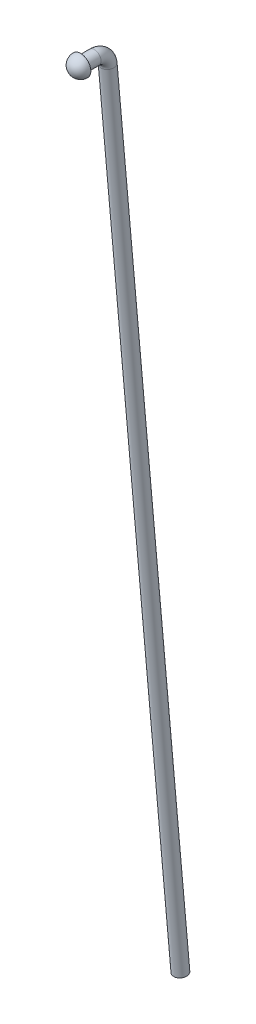
ISO-10303-21;
HEADER;
FILE_DESCRIPTION(('STEP AP214'),'2;1');
FILE_NAME('part.step','',(''),(''),'','','');
FILE_SCHEMA(('AUTOMOTIVE_DESIGN { 1 0 10303 214 1 1 1 1 }'));
ENDSEC;
DATA;
#1=APPLICATION_CONTEXT('core data for automotive mechanical design processes');
#2=APPLICATION_PROTOCOL_DEFINITION('international standard','automotive_design',2000,#1);
#3=PRODUCT_CONTEXT('',#1,'mechanical');
#4=PRODUCT('Part','Part','',(#3));
#5=PRODUCT_RELATED_PRODUCT_CATEGORY('part','',(#4));
#6=PRODUCT_DEFINITION_FORMATION('','',#4);
#7=PRODUCT_DEFINITION_CONTEXT('part definition',#1,'design');
#8=PRODUCT_DEFINITION('design','',#6,#7);
#9=PRODUCT_DEFINITION_SHAPE('','',#8);
#10=(LENGTH_UNIT() NAMED_UNIT(*) SI_UNIT(.MILLI.,.METRE.));
#11=(NAMED_UNIT(*) PLANE_ANGLE_UNIT() SI_UNIT($,.RADIAN.));
#12=(NAMED_UNIT(*) SI_UNIT($,.STERADIAN.) SOLID_ANGLE_UNIT());
#13=UNCERTAINTY_MEASURE_WITH_UNIT(LENGTH_MEASURE(1.E-05),#10,'distance_accuracy_value','');
#14=(GEOMETRIC_REPRESENTATION_CONTEXT(3) GLOBAL_UNCERTAINTY_ASSIGNED_CONTEXT((#13)) GLOBAL_UNIT_ASSIGNED_CONTEXT((#10,
#11,#12)) REPRESENTATION_CONTEXT('',''));
#15=CARTESIAN_POINT('',(0.,0.,0.));
#16=DIRECTION('',(0.,0.,1.));
#17=DIRECTION('',(1.,0.,0.));
#18=AXIS2_PLACEMENT_3D('',#15,#16,#17);
#19=CARTESIAN_POINT('',(0.,36.6313883586025,-6.08176841179734));
#20=DIRECTION('',(0.,-0.996118261044952,-0.0880250533245001));
#21=DIRECTION('',(0.,0.0880250533245001,-0.996118261044952));
#22=AXIS2_PLACEMENT_3D('',#19,#20,#21);
#23=CYLINDRICAL_SURFACE('',#22,1.5);
#24=CARTESIAN_POINT('',(0.,36.6313883586025,-6.08176841179734));
#25=DIRECTION('',(0.,0.996118261044953,0.0880250533244859));
#26=DIRECTION('',(1.,0.,0.));
#27=AXIS2_PLACEMENT_3D('',#24,#25,#26);
#28=CIRCLE('',#27,1.5);
#29=CARTESIAN_POINT('',(0.,36.7634259385892,-7.57594580336477));
#30=VERTEX_POINT('',#29);
#31=EDGE_CURVE('E38',#30,#30,#28,.T.);
#32=ORIENTED_EDGE('',*,*,#31,.F.);
#33=EDGE_LOOP('',(#32));
#34=FACE_BOUND('',#33,.T.);
#35=CARTESIAN_POINT('',(0.,-148.30136718224,-22.4239200463358));
#36=DIRECTION('',(0.,0.996118261044953,0.0880250533244859));
#37=DIRECTION('',(1.,0.,0.));
#38=AXIS2_PLACEMENT_3D('',#35,#36,#37);
#39=CIRCLE('',#38,1.5);
#40=CARTESIAN_POINT('',(1.5,-148.30136718224,-22.4239200463358));
#41=VERTEX_POINT('',#40);
#42=EDGE_CURVE('E10',#41,#41,#39,.T.);
#43=ORIENTED_EDGE('',*,*,#42,.T.);
#44=EDGE_LOOP('',(#43));
#45=FACE_BOUND('',#44,.T.);
#46=ADVANCED_FACE('F32',(#34,#45),#23,.T.);
#47=CARTESIAN_POINT('',(0.,36.367313198629,-3.09341362866248));
#48=DIRECTION('',(-1.,0.,0.));
#49=DIRECTION('',(0.,0.,1.));
#50=AXIS2_PLACEMENT_3D('',#47,#48,#49);
#51=TOROIDAL_SURFACE('',#50,3.00000000000001,1.5);
#52=CARTESIAN_POINT('',(0.,39.367313198629,-3.09341362866245));
#53=DIRECTION('',(0.,0.,1.));
#54=DIRECTION('',(1.,0.,0.));
#55=AXIS2_PLACEMENT_3D('',#52,#53,#54);
#56=CIRCLE('',#55,1.5);
#57=CARTESIAN_POINT('',(0.,40.867313198629,-3.09341362866244));
#58=VERTEX_POINT('',#57);
#59=EDGE_CURVE('E42',#58,#58,#56,.T.);
#60=CARTESIAN_POINT('',(0.,36.367313198629,-3.09341362866248));
#61=DIRECTION('',(-1.,0.,0.));
#62=DIRECTION('',(0.,0.,1.));
#63=AXIS2_PLACEMENT_3D('',#60,#61,#62);
#64=CIRCLE('',#63,4.50000000000001);
#65=EDGE_CURVE('',#58,#30,#64,.T.);
#66=ORIENTED_EDGE('',*,*,#59,.F.);
#67=ORIENTED_EDGE('',*,*,#31,.T.);
#68=ORIENTED_EDGE('',*,*,#65,.T.);
#69=ORIENTED_EDGE('',*,*,#65,.F.);
#70=EDGE_LOOP('',(#66,#68,#67,#69));
#71=FACE_BOUND('',#70,.T.);
#72=ADVANCED_FACE('F71',(#71),#51,.T.);
#73=CARTESIAN_POINT('',(0.,39.367313198629,-3.09341362866245));
#74=DIRECTION('',(0.,0.,1.));
#75=DIRECTION('',(0.,-1.,0.));
#76=AXIS2_PLACEMENT_3D('',#73,#74,#75);
#77=CYLINDRICAL_SURFACE('',#76,1.5);
#78=ORIENTED_EDGE('',*,*,#59,.T.);
#79=EDGE_LOOP('',(#78));
#80=FACE_BOUND('',#79,.T.);
#81=CARTESIAN_POINT('',(0.,39.367313198629,0.));
#82=DIRECTION('',(0.,0.,1.));
#83=DIRECTION('',(1.,0.,0.));
#84=AXIS2_PLACEMENT_3D('',#81,#82,#83);
#85=CIRCLE('',#84,1.5);
#86=CARTESIAN_POINT('',(1.5,39.367313198629,0.));
#87=VERTEX_POINT('',#86);
#88=EDGE_CURVE('E46',#87,#87,#85,.T.);
#89=ORIENTED_EDGE('',*,*,#88,.F.);
#90=EDGE_LOOP('',(#89));
#91=FACE_BOUND('',#90,.T.);
#92=ADVANCED_FACE('F67',(#80,#91),#77,.T.);
#93=CARTESIAN_POINT('',(0.,-148.30136718224,-22.4239200463358));
#94=DIRECTION('',(0.,0.996118261044953,0.0880250533244859));
#95=DIRECTION('',(1.,0.,0.));
#96=AXIS2_PLACEMENT_3D('',#93,#94,#95);
#97=PLANE('',#96);
#98=ORIENTED_EDGE('',*,*,#42,.F.);
#99=EDGE_LOOP('',(#98));
#100=FACE_BOUND('',#99,.T.);
#101=ADVANCED_FACE('F59',(#100),#97,.F.);
#102=CARTESIAN_POINT('',(0.,39.367313198629,0.));
#103=DIRECTION('',(0.,0.,1.));
#104=DIRECTION('',(1.,0.,0.));
#105=AXIS2_PLACEMENT_3D('',#102,#103,#104);
#106=PLANE('',#105);
#107=ORIENTED_EDGE('',*,*,#88,.T.);
#108=EDGE_LOOP('',(#107));
#109=FACE_BOUND('',#108,.T.);
#110=CARTESIAN_POINT('',(0.,39.367313198629,0.));
#111=DIRECTION('',(0.,0.,1.));
#112=DIRECTION('',(1.,0.,0.));
#113=AXIS2_PLACEMENT_3D('',#110,#111,#112);
#114=CIRCLE('',#113,2.3);
#115=CARTESIAN_POINT('',(2.3,39.367313198629,0.));
#116=VERTEX_POINT('',#115);
#117=EDGE_CURVE('E50',#116,#116,#114,.T.);
#118=ORIENTED_EDGE('',*,*,#117,.F.);
#119=EDGE_LOOP('',(#118));
#120=FACE_BOUND('',#119,.T.);
#121=ADVANCED_FACE('F57',(#109,#120),#106,.F.);
#122=CARTESIAN_POINT('',(0.,39.367313198629,0.));
#123=DIRECTION('',(0.,0.,1.));
#124=DIRECTION('',(0.,1.,0.));
#125=AXIS2_PLACEMENT_3D('',#122,#123,#124);
#126=SPHERICAL_SURFACE('',#125,2.3);
#127=ORIENTED_EDGE('',*,*,#117,.T.);
#128=EDGE_LOOP('',(#127));
#129=FACE_BOUND('',#128,.T.);
#130=ADVANCED_FACE('F55',(#129),#126,.T.);
#131=CLOSED_SHELL('',(#46,#72,#92,#101,#121,#130));
#132=MANIFOLD_SOLID_BREP('B2',#131);
#133=ADVANCED_BREP_SHAPE_REPRESENTATION('',(#18,#132),#14);
#134=SHAPE_DEFINITION_REPRESENTATION(#9,#133);
ENDSEC;
END-ISO-10303-21;
